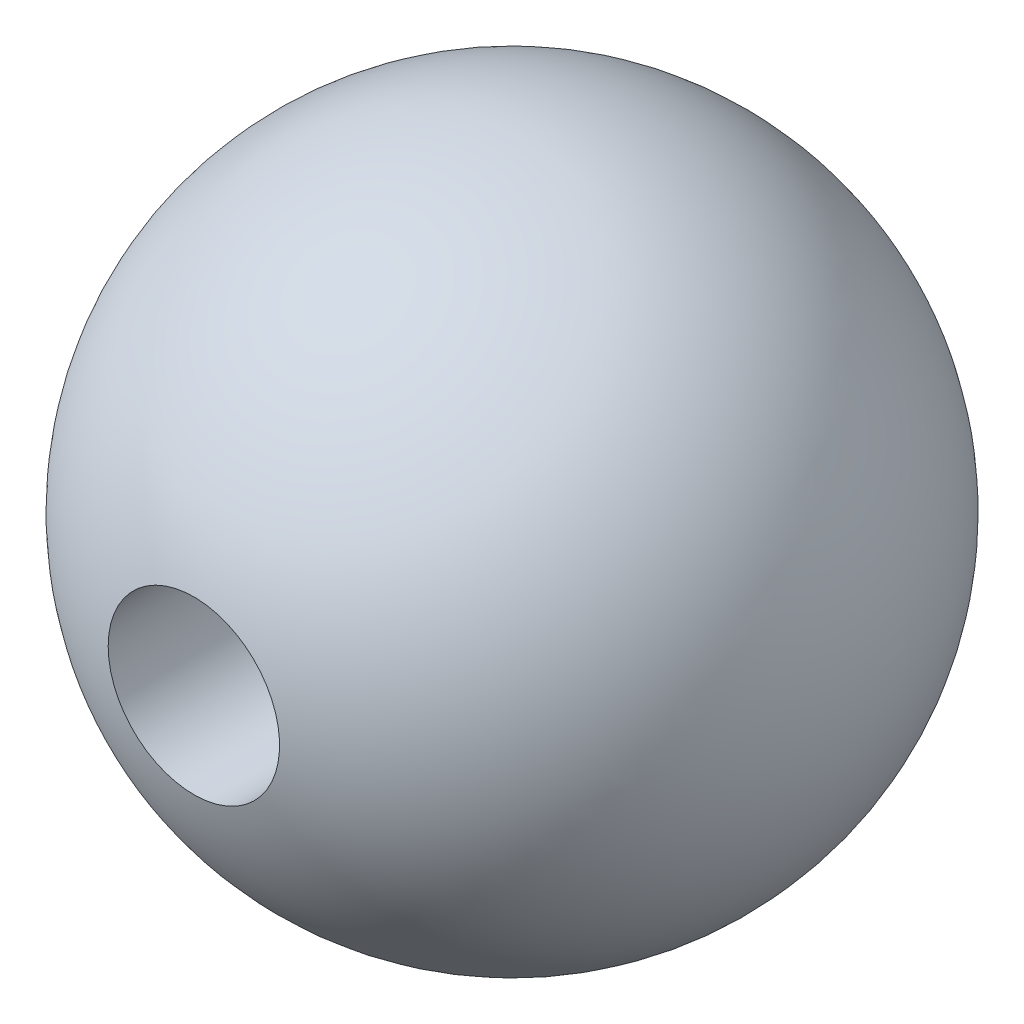
ISO-10303-21;
HEADER;
FILE_DESCRIPTION(('STEP AP214'),'2;1');
FILE_NAME('part.step','',(''),(''),'','','');
FILE_SCHEMA(('AUTOMOTIVE_DESIGN { 1 0 10303 214 1 1 1 1 }'));
ENDSEC;
DATA;
#1=APPLICATION_CONTEXT('core data for automotive mechanical design processes');
#2=APPLICATION_PROTOCOL_DEFINITION('international standard','automotive_design',2000,#1);
#3=PRODUCT_CONTEXT('',#1,'mechanical');
#4=PRODUCT('Part','Part','',(#3));
#5=PRODUCT_RELATED_PRODUCT_CATEGORY('part','',(#4));
#6=PRODUCT_DEFINITION_FORMATION('','',#4);
#7=PRODUCT_DEFINITION_CONTEXT('part definition',#1,'design');
#8=PRODUCT_DEFINITION('design','',#6,#7);
#9=PRODUCT_DEFINITION_SHAPE('','',#8);
#10=(LENGTH_UNIT() NAMED_UNIT(*) SI_UNIT(.MILLI.,.METRE.));
#11=(NAMED_UNIT(*) PLANE_ANGLE_UNIT() SI_UNIT($,.RADIAN.));
#12=(NAMED_UNIT(*) SI_UNIT($,.STERADIAN.) SOLID_ANGLE_UNIT());
#13=UNCERTAINTY_MEASURE_WITH_UNIT(LENGTH_MEASURE(1.E-05),#10,'distance_accuracy_value','');
#14=(GEOMETRIC_REPRESENTATION_CONTEXT(3) GLOBAL_UNCERTAINTY_ASSIGNED_CONTEXT((#13)) GLOBAL_UNIT_ASSIGNED_CONTEXT((#10,
#11,#12)) REPRESENTATION_CONTEXT('',''));
#15=CARTESIAN_POINT('',(0.,0.,0.));
#16=DIRECTION('',(0.,0.,1.));
#17=DIRECTION('',(1.,0.,0.));
#18=AXIS2_PLACEMENT_3D('',#15,#16,#17);
#19=CARTESIAN_POINT('',(0.,0.,0.));
#20=DIRECTION('',(0.,-1.,0.));
#21=DIRECTION('',(-1.,0.,0.));
#22=AXIS2_PLACEMENT_3D('',#19,#20,#21);
#23=SPHERICAL_SURFACE('',#22,12.7);
#24=CARTESIAN_POINT('',(0.,0.,0.));
#25=DIRECTION('',(0.,0.,-1.));
#26=DIRECTION('',(-1.,0.,0.));
#27=AXIS2_PLACEMENT_3D('',#24,#25,#26);
#28=SPHERICAL_SURFACE('',#27,12.7);
#29=CARTESIAN_POINT('',(0.,0.,12.2632294278465));
#30=DIRECTION('',(0.,0.,-1.));
#31=DIRECTION('',(-1.,0.,0.));
#32=AXIS2_PLACEMENT_3D('',#29,#30,#31);
#33=CIRCLE('',#32,3.302);
#34=CARTESIAN_POINT('',(-3.302,0.,12.2632294278465));
#35=VERTEX_POINT('',#34);
#36=EDGE_CURVE('E10',#35,#35,#33,.T.);
#37=ORIENTED_EDGE('',*,*,#36,.T.);
#38=EDGE_LOOP('',(#37));
#39=FACE_BOUND('',#38,.T.);
#40=CARTESIAN_POINT('',(0.,0.,-12.2632294278465));
#41=DIRECTION('',(0.,0.,1.));
#42=DIRECTION('',(1.,0.,0.));
#43=AXIS2_PLACEMENT_3D('',#40,#41,#42);
#44=CIRCLE('',#43,3.302);
#45=CARTESIAN_POINT('',(3.302,0.,-12.2632294278465));
#46=VERTEX_POINT('',#45);
#47=EDGE_CURVE('E47',#46,#46,#44,.T.);
#48=ORIENTED_EDGE('',*,*,#47,.T.);
#49=EDGE_LOOP('',(#48));
#50=FACE_BOUND('',#49,.T.);
#51=ADVANCED_FACE('F40',(#39,#50),#28,.T.);
#52=CARTESIAN_POINT('',(0.,0.,-12.7));
#53=DIRECTION('',(0.,0.,1.));
#54=DIRECTION('',(1.,0.,0.));
#55=AXIS2_PLACEMENT_3D('',#52,#53,#54);
#56=CYLINDRICAL_SURFACE('',#55,3.302);
#57=ORIENTED_EDGE('',*,*,#47,.F.);
#58=EDGE_LOOP('',(#57));
#59=FACE_BOUND('',#58,.T.);
#60=ORIENTED_EDGE('',*,*,#36,.F.);
#61=EDGE_LOOP('',(#60));
#62=FACE_BOUND('',#61,.T.);
#63=ADVANCED_FACE('F55',(#59,#62),#56,.F.);
#64=CLOSED_SHELL('',(#51,#63));
#65=MANIFOLD_SOLID_BREP('B2',#64);
#66=ADVANCED_BREP_SHAPE_REPRESENTATION('',(#18,#65),#14);
#67=SHAPE_DEFINITION_REPRESENTATION(#9,#66);
ENDSEC;
END-ISO-10303-21;
